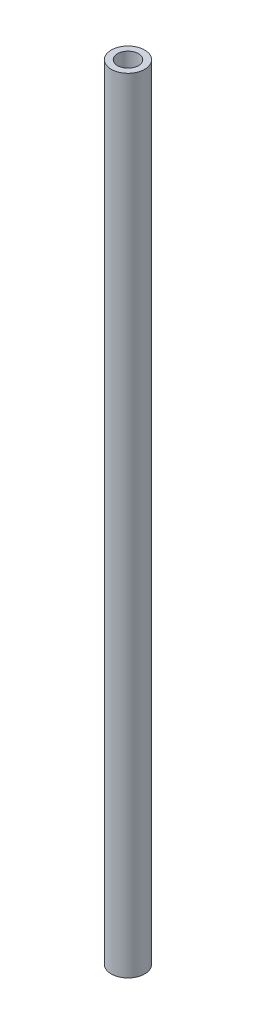
ISO-10303-21;
HEADER;
FILE_DESCRIPTION(('STEP AP214'),'2;1');
FILE_NAME('part.step','',(''),(''),'','','');
FILE_SCHEMA(('AUTOMOTIVE_DESIGN { 1 0 10303 214 1 1 1 1 }'));
ENDSEC;
DATA;
#1=APPLICATION_CONTEXT('core data for automotive mechanical design processes');
#2=APPLICATION_PROTOCOL_DEFINITION('international standard','automotive_design',2000,#1);
#3=PRODUCT_CONTEXT('',#1,'mechanical');
#4=PRODUCT('Part','Part','',(#3));
#5=PRODUCT_RELATED_PRODUCT_CATEGORY('part','',(#4));
#6=PRODUCT_DEFINITION_FORMATION('','',#4);
#7=PRODUCT_DEFINITION_CONTEXT('part definition',#1,'design');
#8=PRODUCT_DEFINITION('design','',#6,#7);
#9=PRODUCT_DEFINITION_SHAPE('','',#8);
#10=(LENGTH_UNIT() NAMED_UNIT(*) SI_UNIT(.MILLI.,.METRE.));
#11=(NAMED_UNIT(*) PLANE_ANGLE_UNIT() SI_UNIT($,.RADIAN.));
#12=(NAMED_UNIT(*) SI_UNIT($,.STERADIAN.) SOLID_ANGLE_UNIT());
#13=UNCERTAINTY_MEASURE_WITH_UNIT(LENGTH_MEASURE(1.E-05),#10,'distance_accuracy_value','');
#14=(GEOMETRIC_REPRESENTATION_CONTEXT(3) GLOBAL_UNCERTAINTY_ASSIGNED_CONTEXT((#13)) GLOBAL_UNIT_ASSIGNED_CONTEXT((#10,
#11,#12)) REPRESENTATION_CONTEXT('',''));
#15=CARTESIAN_POINT('',(0.,0.,0.));
#16=DIRECTION('',(0.,0.,1.));
#17=DIRECTION('',(1.,0.,0.));
#18=AXIS2_PLACEMENT_3D('',#15,#16,#17);
#19=CARTESIAN_POINT('',(0.,150.,0.));
#20=DIRECTION('',(0.,-1.,0.));
#21=DIRECTION('',(0.,0.,-1.));
#22=AXIS2_PLACEMENT_3D('',#19,#20,#21);
#23=CYLINDRICAL_SURFACE('',#22,3.2);
#24=CARTESIAN_POINT('',(0.,150.,0.));
#25=DIRECTION('',(0.,1.,0.));
#26=DIRECTION('',(0.,0.,1.));
#27=AXIS2_PLACEMENT_3D('',#24,#25,#26);
#28=CIRCLE('',#27,3.2);
#29=CARTESIAN_POINT('',(0.,150.,3.2));
#30=VERTEX_POINT('',#29);
#31=EDGE_CURVE('E10',#30,#30,#28,.T.);
#32=ORIENTED_EDGE('',*,*,#31,.F.);
#33=EDGE_LOOP('',(#32));
#34=FACE_BOUND('',#33,.T.);
#35=CARTESIAN_POINT('',(0.,0.,0.));
#36=DIRECTION('',(0.,1.,0.));
#37=DIRECTION('',(0.,0.,1.));
#38=AXIS2_PLACEMENT_3D('',#35,#36,#37);
#39=CIRCLE('',#38,3.2);
#40=CARTESIAN_POINT('',(0.,0.,3.2));
#41=VERTEX_POINT('',#40);
#42=EDGE_CURVE('E34',#41,#41,#39,.T.);
#43=ORIENTED_EDGE('',*,*,#42,.T.);
#44=EDGE_LOOP('',(#43));
#45=FACE_BOUND('',#44,.T.);
#46=ADVANCED_FACE('F31',(#34,#45),#23,.T.);
#47=CARTESIAN_POINT('',(0.,150.,0.));
#48=DIRECTION('',(0.,1.,0.));
#49=DIRECTION('',(0.,0.,1.));
#50=AXIS2_PLACEMENT_3D('',#47,#48,#49);
#51=PLANE('',#50);
#52=CARTESIAN_POINT('',(0.,150.,0.));
#53=DIRECTION('',(0.,1.,0.));
#54=DIRECTION('',(0.,0.,1.));
#55=AXIS2_PLACEMENT_3D('',#52,#53,#54);
#56=CIRCLE('',#55,2.);
#57=CARTESIAN_POINT('',(0.,150.,2.));
#58=VERTEX_POINT('',#57);
#59=EDGE_CURVE('E43',#58,#58,#56,.T.);
#60=ORIENTED_EDGE('',*,*,#59,.F.);
#61=EDGE_LOOP('',(#60));
#62=FACE_BOUND('',#61,.T.);
#63=ORIENTED_EDGE('',*,*,#31,.T.);
#64=EDGE_LOOP('',(#63));
#65=FACE_BOUND('',#64,.T.);
#66=ADVANCED_FACE('F68',(#62,#65),#51,.T.);
#67=CARTESIAN_POINT('',(0.,0.,0.));
#68=DIRECTION('',(0.,1.,0.));
#69=DIRECTION('',(0.,0.,1.));
#70=AXIS2_PLACEMENT_3D('',#67,#68,#69);
#71=PLANE('',#70);
#72=CARTESIAN_POINT('',(0.,0.,0.));
#73=DIRECTION('',(0.,-1.,0.));
#74=DIRECTION('',(0.,0.,-1.));
#75=AXIS2_PLACEMENT_3D('',#72,#73,#74);
#76=CIRCLE('',#75,2.);
#77=CARTESIAN_POINT('',(0.,0.,-2.));
#78=VERTEX_POINT('',#77);
#79=EDGE_CURVE('E49',#78,#78,#76,.T.);
#80=ORIENTED_EDGE('',*,*,#79,.F.);
#81=EDGE_LOOP('',(#80));
#82=FACE_BOUND('',#81,.T.);
#83=ORIENTED_EDGE('',*,*,#42,.F.);
#84=EDGE_LOOP('',(#83));
#85=FACE_BOUND('',#84,.T.);
#86=ADVANCED_FACE('F64',(#82,#85),#71,.F.);
#87=CARTESIAN_POINT('',(0.,137.5,0.));
#88=DIRECTION('',(0.,1.,0.));
#89=DIRECTION('',(0.,0.,1.));
#90=AXIS2_PLACEMENT_3D('',#87,#88,#89);
#91=CYLINDRICAL_SURFACE('',#90,2.);
#92=CARTESIAN_POINT('',(0.,137.5,0.));
#93=DIRECTION('',(0.,1.,0.));
#94=DIRECTION('',(0.,0.,1.));
#95=AXIS2_PLACEMENT_3D('',#92,#93,#94);
#96=CIRCLE('',#95,2.);
#97=CARTESIAN_POINT('',(0.,137.5,2.));
#98=VERTEX_POINT('',#97);
#99=EDGE_CURVE('E41',#98,#98,#96,.T.);
#100=ORIENTED_EDGE('',*,*,#99,.F.);
#101=EDGE_LOOP('',(#100));
#102=FACE_BOUND('',#101,.T.);
#103=ORIENTED_EDGE('',*,*,#59,.T.);
#104=EDGE_LOOP('',(#103));
#105=FACE_BOUND('',#104,.T.);
#106=ADVANCED_FACE('F67',(#102,#105),#91,.F.);
#107=CARTESIAN_POINT('',(0.,137.5,0.));
#108=DIRECTION('',(0.,1.,0.));
#109=DIRECTION('',(0.,0.,1.));
#110=AXIS2_PLACEMENT_3D('',#107,#108,#109);
#111=PLANE('',#110);
#112=ORIENTED_EDGE('',*,*,#99,.T.);
#113=EDGE_LOOP('',(#112));
#114=FACE_BOUND('',#113,.T.);
#115=ADVANCED_FACE('F60',(#114),#111,.T.);
#116=CARTESIAN_POINT('',(0.,12.5,0.));
#117=DIRECTION('',(0.,-1.,0.));
#118=DIRECTION('',(0.,0.,-1.));
#119=AXIS2_PLACEMENT_3D('',#116,#117,#118);
#120=CYLINDRICAL_SURFACE('',#119,2.);
#121=CARTESIAN_POINT('',(0.,12.5,0.));
#122=DIRECTION('',(0.,-1.,0.));
#123=DIRECTION('',(0.,0.,-1.));
#124=AXIS2_PLACEMENT_3D('',#121,#122,#123);
#125=CIRCLE('',#124,2.);
#126=CARTESIAN_POINT('',(0.,12.5,-2.));
#127=VERTEX_POINT('',#126);
#128=EDGE_CURVE('E46',#127,#127,#125,.T.);
#129=ORIENTED_EDGE('',*,*,#128,.F.);
#130=EDGE_LOOP('',(#129));
#131=FACE_BOUND('',#130,.T.);
#132=ORIENTED_EDGE('',*,*,#79,.T.);
#133=EDGE_LOOP('',(#132));
#134=FACE_BOUND('',#133,.T.);
#135=ADVANCED_FACE('F57',(#131,#134),#120,.F.);
#136=CARTESIAN_POINT('',(0.,12.5,0.));
#137=DIRECTION('',(0.,-1.,0.));
#138=DIRECTION('',(0.,0.,-1.));
#139=AXIS2_PLACEMENT_3D('',#136,#137,#138);
#140=PLANE('',#139);
#141=ORIENTED_EDGE('',*,*,#128,.T.);
#142=EDGE_LOOP('',(#141));
#143=FACE_BOUND('',#142,.T.);
#144=ADVANCED_FACE('F55',(#143),#140,.T.);
#145=CLOSED_SHELL('',(#46,#66,#86,#106,#115,#135,#144));
#146=MANIFOLD_SOLID_BREP('B2',#145);
#147=ADVANCED_BREP_SHAPE_REPRESENTATION('',(#18,#146),#14);
#148=SHAPE_DEFINITION_REPRESENTATION(#9,#147);
ENDSEC;
END-ISO-10303-21;
